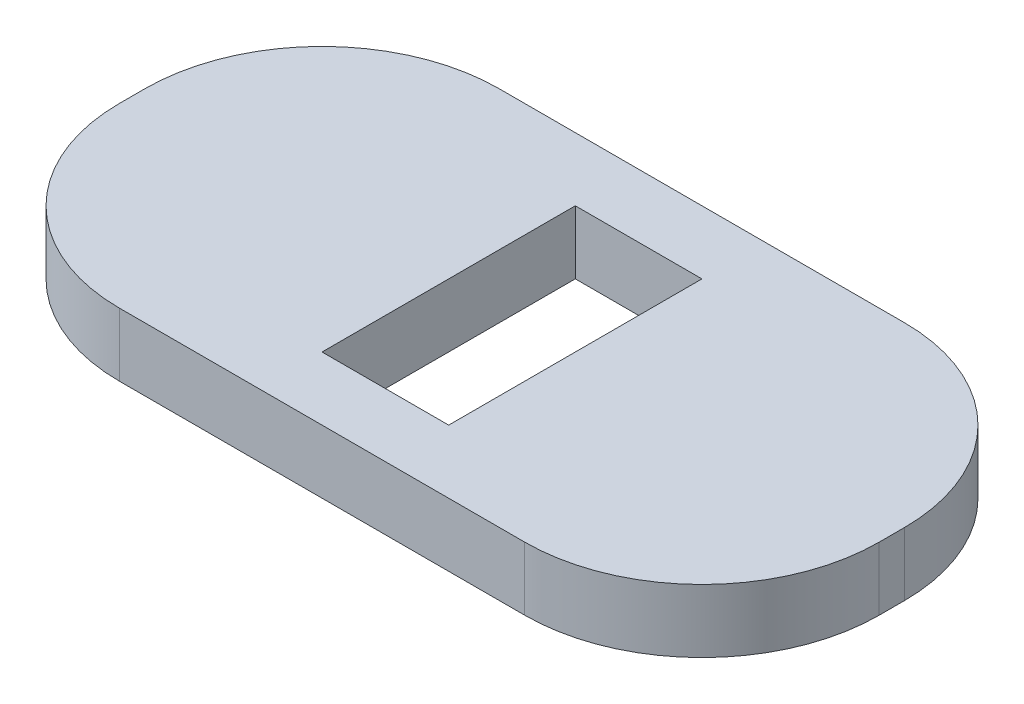
ISO-10303-21;
HEADER;
FILE_DESCRIPTION(('STEP AP214'),'2;1');
FILE_NAME('part.step','',(''),(''),'','','');
FILE_SCHEMA(('AUTOMOTIVE_DESIGN { 1 0 10303 214 1 1 1 1 }'));
ENDSEC;
DATA;
#1=APPLICATION_CONTEXT('core data for automotive mechanical design processes');
#2=APPLICATION_PROTOCOL_DEFINITION('international standard','automotive_design',2000,#1);
#3=PRODUCT_CONTEXT('',#1,'mechanical');
#4=PRODUCT('Part','Part','',(#3));
#5=PRODUCT_RELATED_PRODUCT_CATEGORY('part','',(#4));
#6=PRODUCT_DEFINITION_FORMATION('','',#4);
#7=PRODUCT_DEFINITION_CONTEXT('part definition',#1,'design');
#8=PRODUCT_DEFINITION('design','',#6,#7);
#9=PRODUCT_DEFINITION_SHAPE('','',#8);
#10=(LENGTH_UNIT() NAMED_UNIT(*) SI_UNIT(.MILLI.,.METRE.));
#11=(NAMED_UNIT(*) PLANE_ANGLE_UNIT() SI_UNIT($,.RADIAN.));
#12=(NAMED_UNIT(*) SI_UNIT($,.STERADIAN.) SOLID_ANGLE_UNIT());
#13=UNCERTAINTY_MEASURE_WITH_UNIT(LENGTH_MEASURE(1.E-05),#10,'distance_accuracy_value','');
#14=(GEOMETRIC_REPRESENTATION_CONTEXT(3) GLOBAL_UNCERTAINTY_ASSIGNED_CONTEXT((#13)) GLOBAL_UNIT_ASSIGNED_CONTEXT((#10,
#11,#12)) REPRESENTATION_CONTEXT('',''));
#15=CARTESIAN_POINT('',(0.,0.,0.));
#16=DIRECTION('',(0.,0.,1.));
#17=DIRECTION('',(1.,0.,0.));
#18=AXIS2_PLACEMENT_3D('',#15,#16,#17);
#19=CARTESIAN_POINT('',(58.42,6.35,-17.78));
#20=DIRECTION('',(0.,1.,0.));
#21=DIRECTION('',(0.,0.,1.));
#22=AXIS2_PLACEMENT_3D('',#19,#20,#21);
#23=PLANE('',#22);
#24=CARTESIAN_POINT('',(58.42,6.35,-17.78));
#25=DIRECTION('',(0.,1.,0.));
#26=DIRECTION('',(0.,0.,1.));
#27=AXIS2_PLACEMENT_3D('',#24,#25,#26);
#28=CIRCLE('',#27,17.78);
#29=CARTESIAN_POINT('',(58.4199999999999,6.35,0.));
#30=VERTEX_POINT('',#29);
#31=CARTESIAN_POINT('',(76.2,6.35,-17.7800000000001));
#32=VERTEX_POINT('',#31);
#33=EDGE_CURVE('E158',#30,#32,#28,.T.);
#34=ORIENTED_EDGE('',*,*,#33,.T.);
#35=DIRECTION('',(0.,0.,-1.));
#36=VECTOR('',#35,1.);
#37=CARTESIAN_POINT('',(76.2,6.35,-17.7800000000001));
#38=LINE('',#37,#36);
#39=CARTESIAN_POINT('',(76.2,6.35,-20.3199999999999));
#40=VERTEX_POINT('',#39);
#41=EDGE_CURVE('E161',#32,#40,#38,.T.);
#42=ORIENTED_EDGE('',*,*,#41,.T.);
#43=CARTESIAN_POINT('',(58.42,6.35,-20.32));
#44=DIRECTION('',(0.,1.,0.));
#45=DIRECTION('',(0.,0.,-1.));
#46=AXIS2_PLACEMENT_3D('',#43,#44,#45);
#47=CIRCLE('',#46,17.78);
#48=CARTESIAN_POINT('',(58.4199999999999,6.35,-38.1));
#49=VERTEX_POINT('',#48);
#50=EDGE_CURVE('E164',#40,#49,#47,.T.);
#51=ORIENTED_EDGE('',*,*,#50,.T.);
#52=DIRECTION('',(-1.,0.,0.));
#53=VECTOR('',#52,1.);
#54=CARTESIAN_POINT('',(17.7800000000001,6.35,-38.1));
#55=LINE('',#54,#53);
#56=CARTESIAN_POINT('',(17.7800000000001,6.35,-38.1));
#57=VERTEX_POINT('',#56);
#58=EDGE_CURVE('E166',#49,#57,#55,.T.);
#59=ORIENTED_EDGE('',*,*,#58,.T.);
#60=CARTESIAN_POINT('',(17.78,6.35,-20.32));
#61=DIRECTION('',(0.,1.,0.));
#62=DIRECTION('',(0.,0.,-1.));
#63=AXIS2_PLACEMENT_3D('',#60,#61,#62);
#64=CIRCLE('',#63,17.78);
#65=CARTESIAN_POINT('',(0.,6.35,-20.3199999999999));
#66=VERTEX_POINT('',#65);
#67=EDGE_CURVE('E168',#57,#66,#64,.T.);
#68=ORIENTED_EDGE('',*,*,#67,.T.);
#69=DIRECTION('',(0.,0.,1.));
#70=VECTOR('',#69,1.);
#71=CARTESIAN_POINT('',(0.,6.35,-17.7800000000001));
#72=LINE('',#71,#70);
#73=CARTESIAN_POINT('',(0.,6.35,-17.7800000000001));
#74=VERTEX_POINT('',#73);
#75=EDGE_CURVE('E170',#66,#74,#72,.T.);
#76=ORIENTED_EDGE('',*,*,#75,.T.);
#77=CARTESIAN_POINT('',(17.78,6.35,-17.78));
#78=DIRECTION('',(0.,1.,0.));
#79=DIRECTION('',(0.,0.,-1.));
#80=AXIS2_PLACEMENT_3D('',#77,#78,#79);
#81=CIRCLE('',#80,17.78);
#82=CARTESIAN_POINT('',(17.7800000000001,6.35,0.));
#83=VERTEX_POINT('',#82);
#84=EDGE_CURVE('E172',#74,#83,#81,.T.);
#85=ORIENTED_EDGE('',*,*,#84,.T.);
#86=DIRECTION('',(1.,0.,0.));
#87=VECTOR('',#86,1.);
#88=CARTESIAN_POINT('',(17.7800000000001,6.35,0.));
#89=LINE('',#88,#87);
#90=EDGE_CURVE('E174',#83,#30,#89,.T.);
#91=ORIENTED_EDGE('',*,*,#90,.T.);
#92=EDGE_LOOP('',(#34,#42,#51,#59,#68,#76,#85,#91));
#93=FACE_BOUND('',#92,.T.);
#94=DIRECTION('',(-1.,0.,0.));
#95=VECTOR('',#94,1.);
#96=CARTESIAN_POINT('',(31.75,6.35,-31.75));
#97=LINE('',#96,#95);
#98=CARTESIAN_POINT('',(44.45,6.35,-31.75));
#99=VERTEX_POINT('',#98);
#100=CARTESIAN_POINT('',(31.75,6.35,-31.75));
#101=VERTEX_POINT('',#100);
#102=EDGE_CURVE('E130',#99,#101,#97,.T.);
#103=ORIENTED_EDGE('',*,*,#102,.F.);
#104=DIRECTION('',(0.,0.,-1.));
#105=VECTOR('',#104,1.);
#106=CARTESIAN_POINT('',(44.45,6.35,-6.35));
#107=LINE('',#106,#105);
#108=CARTESIAN_POINT('',(44.45,6.35,-6.35));
#109=VERTEX_POINT('',#108);
#110=EDGE_CURVE('E122',#109,#99,#107,.T.);
#111=ORIENTED_EDGE('',*,*,#110,.F.);
#112=DIRECTION('',(1.,0.,0.));
#113=VECTOR('',#112,1.);
#114=CARTESIAN_POINT('',(31.75,6.35,-6.35));
#115=LINE('',#114,#113);
#116=CARTESIAN_POINT('',(31.75,6.35,-6.35));
#117=VERTEX_POINT('',#116);
#118=EDGE_CURVE('E144',#117,#109,#115,.T.);
#119=ORIENTED_EDGE('',*,*,#118,.F.);
#120=DIRECTION('',(0.,0.,1.));
#121=VECTOR('',#120,1.);
#122=CARTESIAN_POINT('',(31.75,6.35,-6.35));
#123=LINE('',#122,#121);
#124=EDGE_CURVE('E142',#101,#117,#123,.T.);
#125=ORIENTED_EDGE('',*,*,#124,.F.);
#126=EDGE_LOOP('',(#103,#111,#119,#125));
#127=FACE_BOUND('',#126,.T.);
#128=ADVANCED_FACE('F33',(#93,#127),#23,.T.);
#129=CARTESIAN_POINT('',(58.42,0.,-17.78));
#130=DIRECTION('',(0.,1.,0.));
#131=DIRECTION('',(0.,0.,1.));
#132=AXIS2_PLACEMENT_3D('',#129,#130,#131);
#133=PLANE('',#132);
#134=CARTESIAN_POINT('',(58.42,0.,-17.78));
#135=DIRECTION('',(0.,1.,0.));
#136=DIRECTION('',(0.,0.,1.));
#137=AXIS2_PLACEMENT_3D('',#134,#135,#136);
#138=CIRCLE('',#137,17.78);
#139=CARTESIAN_POINT('',(58.4199999999999,0.,0.));
#140=VERTEX_POINT('',#139);
#141=CARTESIAN_POINT('',(76.2,0.,-17.7800000000001));
#142=VERTEX_POINT('',#141);
#143=EDGE_CURVE('E138',#140,#142,#138,.T.);
#144=ORIENTED_EDGE('',*,*,#143,.F.);
#145=DIRECTION('',(1.,0.,0.));
#146=VECTOR('',#145,1.);
#147=CARTESIAN_POINT('',(17.7800000000001,0.,0.));
#148=LINE('',#147,#146);
#149=CARTESIAN_POINT('',(17.7800000000001,0.,0.));
#150=VERTEX_POINT('',#149);
#151=EDGE_CURVE('E162',#150,#140,#148,.T.);
#152=ORIENTED_EDGE('',*,*,#151,.F.);
#153=CARTESIAN_POINT('',(17.78,0.,-17.78));
#154=DIRECTION('',(0.,1.,0.));
#155=DIRECTION('',(0.,0.,-1.));
#156=AXIS2_PLACEMENT_3D('',#153,#154,#155);
#157=CIRCLE('',#156,17.78);
#158=CARTESIAN_POINT('',(0.,0.,-17.7800000000001));
#159=VERTEX_POINT('',#158);
#160=EDGE_CURVE('E189',#159,#150,#157,.T.);
#161=ORIENTED_EDGE('',*,*,#160,.F.);
#162=DIRECTION('',(0.,0.,1.));
#163=VECTOR('',#162,1.);
#164=CARTESIAN_POINT('',(0.,0.,-17.7800000000001));
#165=LINE('',#164,#163);
#166=CARTESIAN_POINT('',(0.,0.,-20.3199999999999));
#167=VERTEX_POINT('',#166);
#168=EDGE_CURVE('E187',#167,#159,#165,.T.);
#169=ORIENTED_EDGE('',*,*,#168,.F.);
#170=CARTESIAN_POINT('',(17.78,0.,-20.32));
#171=DIRECTION('',(0.,1.,0.));
#172=DIRECTION('',(0.,0.,-1.));
#173=AXIS2_PLACEMENT_3D('',#170,#171,#172);
#174=CIRCLE('',#173,17.78);
#175=CARTESIAN_POINT('',(17.7800000000001,0.,-38.1));
#176=VERTEX_POINT('',#175);
#177=EDGE_CURVE('E185',#176,#167,#174,.T.);
#178=ORIENTED_EDGE('',*,*,#177,.F.);
#179=DIRECTION('',(-1.,0.,0.));
#180=VECTOR('',#179,1.);
#181=CARTESIAN_POINT('',(17.7800000000001,0.,-38.1));
#182=LINE('',#181,#180);
#183=CARTESIAN_POINT('',(58.4199999999999,0.,-38.1));
#184=VERTEX_POINT('',#183);
#185=EDGE_CURVE('E183',#184,#176,#182,.T.);
#186=ORIENTED_EDGE('',*,*,#185,.F.);
#187=CARTESIAN_POINT('',(58.42,0.,-20.32));
#188=DIRECTION('',(0.,1.,0.));
#189=DIRECTION('',(0.,0.,-1.));
#190=AXIS2_PLACEMENT_3D('',#187,#188,#189);
#191=CIRCLE('',#190,17.78);
#192=CARTESIAN_POINT('',(76.2,0.,-20.3199999999999));
#193=VERTEX_POINT('',#192);
#194=EDGE_CURVE('E181',#193,#184,#191,.T.);
#195=ORIENTED_EDGE('',*,*,#194,.F.);
#196=DIRECTION('',(0.,0.,-1.));
#197=VECTOR('',#196,1.);
#198=CARTESIAN_POINT('',(76.2,0.,-17.7800000000001));
#199=LINE('',#198,#197);
#200=EDGE_CURVE('E179',#142,#193,#199,.T.);
#201=ORIENTED_EDGE('',*,*,#200,.F.);
#202=EDGE_LOOP('',(#144,#152,#161,#169,#178,#186,#195,#201));
#203=FACE_BOUND('',#202,.T.);
#204=DIRECTION('',(0.,0.,-1.));
#205=VECTOR('',#204,1.);
#206=CARTESIAN_POINT('',(44.45,0.,-6.35));
#207=LINE('',#206,#205);
#208=CARTESIAN_POINT('',(44.45,0.,-6.35));
#209=VERTEX_POINT('',#208);
#210=CARTESIAN_POINT('',(44.45,0.,-31.75));
#211=VERTEX_POINT('',#210);
#212=EDGE_CURVE('E56',#209,#211,#207,.T.);
#213=ORIENTED_EDGE('',*,*,#212,.T.);
#214=DIRECTION('',(-1.,0.,0.));
#215=VECTOR('',#214,1.);
#216=CARTESIAN_POINT('',(31.75,0.,-31.75));
#217=LINE('',#216,#215);
#218=CARTESIAN_POINT('',(31.75,0.,-31.75));
#219=VERTEX_POINT('',#218);
#220=EDGE_CURVE('E137',#211,#219,#217,.T.);
#221=ORIENTED_EDGE('',*,*,#220,.T.);
#222=DIRECTION('',(0.,0.,1.));
#223=VECTOR('',#222,1.);
#224=CARTESIAN_POINT('',(31.75,0.,-6.35));
#225=LINE('',#224,#223);
#226=CARTESIAN_POINT('',(31.75,0.,-6.35));
#227=VERTEX_POINT('',#226);
#228=EDGE_CURVE('E150',#219,#227,#225,.T.);
#229=ORIENTED_EDGE('',*,*,#228,.T.);
#230=DIRECTION('',(1.,0.,0.));
#231=VECTOR('',#230,1.);
#232=CARTESIAN_POINT('',(31.75,0.,-6.35));
#233=LINE('',#232,#231);
#234=EDGE_CURVE('E131',#227,#209,#233,.T.);
#235=ORIENTED_EDGE('',*,*,#234,.T.);
#236=EDGE_LOOP('',(#213,#221,#229,#235));
#237=FACE_BOUND('',#236,.T.);
#238=ADVANCED_FACE('F219',(#203,#237),#133,.F.);
#239=CARTESIAN_POINT('',(58.42,6.35,-17.78));
#240=DIRECTION('',(0.,-1.,0.));
#241=DIRECTION('',(0.,0.,-1.));
#242=AXIS2_PLACEMENT_3D('',#239,#240,#241);
#243=CYLINDRICAL_SURFACE('',#242,17.78);
#244=ORIENTED_EDGE('',*,*,#143,.T.);
#245=DIRECTION('',(0.,-1.,0.));
#246=VECTOR('',#245,1.);
#247=CARTESIAN_POINT('',(76.2,6.35,-17.7800000000001));
#248=LINE('',#247,#246);
#249=EDGE_CURVE('E11',#32,#142,#248,.T.);
#250=ORIENTED_EDGE('',*,*,#249,.F.);
#251=ORIENTED_EDGE('',*,*,#33,.F.);
#252=DIRECTION('',(0.,-1.,0.));
#253=VECTOR('',#252,1.);
#254=CARTESIAN_POINT('',(58.4199999999999,6.35,0.));
#255=LINE('',#254,#253);
#256=EDGE_CURVE('E176',#30,#140,#255,.T.);
#257=ORIENTED_EDGE('',*,*,#256,.T.);
#258=EDGE_LOOP('',(#244,#250,#251,#257));
#259=FACE_BOUND('',#258,.T.);
#260=ADVANCED_FACE('F35',(#259),#243,.T.);
#261=CARTESIAN_POINT('',(76.2,6.35,-17.7800000000001));
#262=DIRECTION('',(-1.,0.,0.));
#263=DIRECTION('',(0.,0.,1.));
#264=AXIS2_PLACEMENT_3D('',#261,#262,#263);
#265=PLANE('',#264);
#266=ORIENTED_EDGE('',*,*,#200,.T.);
#267=DIRECTION('',(0.,-1.,0.));
#268=VECTOR('',#267,1.);
#269=CARTESIAN_POINT('',(76.2,6.35,-20.3199999999999));
#270=LINE('',#269,#268);
#271=EDGE_CURVE('E41',#40,#193,#270,.T.);
#272=ORIENTED_EDGE('',*,*,#271,.F.);
#273=ORIENTED_EDGE('',*,*,#41,.F.);
#274=ORIENTED_EDGE('',*,*,#249,.T.);
#275=EDGE_LOOP('',(#266,#272,#273,#274));
#276=FACE_BOUND('',#275,.T.);
#277=ADVANCED_FACE('F236',(#276),#265,.F.);
#278=CARTESIAN_POINT('',(58.42,6.35,-20.32));
#279=DIRECTION('',(0.,-1.,0.));
#280=DIRECTION('',(0.,0.,-1.));
#281=AXIS2_PLACEMENT_3D('',#278,#279,#280);
#282=CYLINDRICAL_SURFACE('',#281,17.78);
#283=ORIENTED_EDGE('',*,*,#194,.T.);
#284=DIRECTION('',(0.,-1.,0.));
#285=VECTOR('',#284,1.);
#286=CARTESIAN_POINT('',(58.4199999999999,6.35,-38.1));
#287=LINE('',#286,#285);
#288=EDGE_CURVE('E206',#49,#184,#287,.T.);
#289=ORIENTED_EDGE('',*,*,#288,.F.);
#290=ORIENTED_EDGE('',*,*,#50,.F.);
#291=ORIENTED_EDGE('',*,*,#271,.T.);
#292=EDGE_LOOP('',(#283,#289,#290,#291));
#293=FACE_BOUND('',#292,.T.);
#294=ADVANCED_FACE('F213',(#293),#282,.T.);
#295=CARTESIAN_POINT('',(17.7800000000001,6.35,-38.1));
#296=DIRECTION('',(0.,0.,1.));
#297=DIRECTION('',(1.,0.,0.));
#298=AXIS2_PLACEMENT_3D('',#295,#296,#297);
#299=PLANE('',#298);
#300=ORIENTED_EDGE('',*,*,#185,.T.);
#301=DIRECTION('',(0.,-1.,0.));
#302=VECTOR('',#301,1.);
#303=CARTESIAN_POINT('',(17.7800000000001,6.35,-38.1));
#304=LINE('',#303,#302);
#305=EDGE_CURVE('E203',#57,#176,#304,.T.);
#306=ORIENTED_EDGE('',*,*,#305,.F.);
#307=ORIENTED_EDGE('',*,*,#58,.F.);
#308=ORIENTED_EDGE('',*,*,#288,.T.);
#309=EDGE_LOOP('',(#300,#306,#307,#308));
#310=FACE_BOUND('',#309,.T.);
#311=ADVANCED_FACE('F225',(#310),#299,.F.);
#312=CARTESIAN_POINT('',(17.78,6.35,-20.32));
#313=DIRECTION('',(0.,-1.,0.));
#314=DIRECTION('',(0.,0.,-1.));
#315=AXIS2_PLACEMENT_3D('',#312,#313,#314);
#316=CYLINDRICAL_SURFACE('',#315,17.78);
#317=ORIENTED_EDGE('',*,*,#177,.T.);
#318=DIRECTION('',(0.,-1.,0.));
#319=VECTOR('',#318,1.);
#320=CARTESIAN_POINT('',(0.,6.35,-20.3199999999999));
#321=LINE('',#320,#319);
#322=EDGE_CURVE('E200',#66,#167,#321,.T.);
#323=ORIENTED_EDGE('',*,*,#322,.F.);
#324=ORIENTED_EDGE('',*,*,#67,.F.);
#325=ORIENTED_EDGE('',*,*,#305,.T.);
#326=EDGE_LOOP('',(#317,#323,#324,#325));
#327=FACE_BOUND('',#326,.T.);
#328=ADVANCED_FACE('F229',(#327),#316,.T.);
#329=CARTESIAN_POINT('',(0.,6.35,-17.7800000000001));
#330=DIRECTION('',(1.,0.,0.));
#331=DIRECTION('',(0.,0.,-1.));
#332=AXIS2_PLACEMENT_3D('',#329,#330,#331);
#333=PLANE('',#332);
#334=ORIENTED_EDGE('',*,*,#168,.T.);
#335=DIRECTION('',(0.,-1.,0.));
#336=VECTOR('',#335,1.);
#337=CARTESIAN_POINT('',(0.,6.35,-17.7800000000001));
#338=LINE('',#337,#336);
#339=EDGE_CURVE('E197',#74,#159,#338,.T.);
#340=ORIENTED_EDGE('',*,*,#339,.F.);
#341=ORIENTED_EDGE('',*,*,#75,.F.);
#342=ORIENTED_EDGE('',*,*,#322,.T.);
#343=EDGE_LOOP('',(#334,#340,#341,#342));
#344=FACE_BOUND('',#343,.T.);
#345=ADVANCED_FACE('F249',(#344),#333,.F.);
#346=CARTESIAN_POINT('',(17.78,6.35,-17.78));
#347=DIRECTION('',(0.,-1.,0.));
#348=DIRECTION('',(0.,0.,-1.));
#349=AXIS2_PLACEMENT_3D('',#346,#347,#348);
#350=CYLINDRICAL_SURFACE('',#349,17.78);
#351=ORIENTED_EDGE('',*,*,#160,.T.);
#352=DIRECTION('',(0.,-1.,0.));
#353=VECTOR('',#352,1.);
#354=CARTESIAN_POINT('',(17.7800000000001,6.35,0.));
#355=LINE('',#354,#353);
#356=EDGE_CURVE('E194',#83,#150,#355,.T.);
#357=ORIENTED_EDGE('',*,*,#356,.F.);
#358=ORIENTED_EDGE('',*,*,#84,.F.);
#359=ORIENTED_EDGE('',*,*,#339,.T.);
#360=EDGE_LOOP('',(#351,#357,#358,#359));
#361=FACE_BOUND('',#360,.T.);
#362=ADVANCED_FACE('F247',(#361),#350,.T.);
#363=CARTESIAN_POINT('',(17.7800000000001,6.35,0.));
#364=DIRECTION('',(0.,0.,-1.));
#365=DIRECTION('',(-1.,0.,0.));
#366=AXIS2_PLACEMENT_3D('',#363,#364,#365);
#367=PLANE('',#366);
#368=ORIENTED_EDGE('',*,*,#151,.T.);
#369=ORIENTED_EDGE('',*,*,#256,.F.);
#370=ORIENTED_EDGE('',*,*,#90,.F.);
#371=ORIENTED_EDGE('',*,*,#356,.T.);
#372=EDGE_LOOP('',(#368,#369,#370,#371));
#373=FACE_BOUND('',#372,.T.);
#374=ADVANCED_FACE('F242',(#373),#367,.F.);
#375=CARTESIAN_POINT('',(44.45,6.35,-6.35));
#376=DIRECTION('',(-1.,0.,0.));
#377=DIRECTION('',(0.,0.,1.));
#378=AXIS2_PLACEMENT_3D('',#375,#376,#377);
#379=PLANE('',#378);
#380=ORIENTED_EDGE('',*,*,#212,.F.);
#381=DIRECTION('',(0.,-1.,0.));
#382=VECTOR('',#381,1.);
#383=CARTESIAN_POINT('',(44.45,6.35,-6.35));
#384=LINE('',#383,#382);
#385=EDGE_CURVE('E126',#109,#209,#384,.T.);
#386=ORIENTED_EDGE('',*,*,#385,.F.);
#387=ORIENTED_EDGE('',*,*,#110,.T.);
#388=DIRECTION('',(0.,-1.,0.));
#389=VECTOR('',#388,1.);
#390=CARTESIAN_POINT('',(44.45,6.35,-31.75));
#391=LINE('',#390,#389);
#392=EDGE_CURVE('E125',#99,#211,#391,.T.);
#393=ORIENTED_EDGE('',*,*,#392,.T.);
#394=EDGE_LOOP('',(#380,#386,#387,#393));
#395=FACE_BOUND('',#394,.T.);
#396=ADVANCED_FACE('F124',(#395),#379,.T.);
#397=CARTESIAN_POINT('',(31.75,6.35,-31.75));
#398=DIRECTION('',(0.,0.,1.));
#399=DIRECTION('',(1.,0.,0.));
#400=AXIS2_PLACEMENT_3D('',#397,#398,#399);
#401=PLANE('',#400);
#402=ORIENTED_EDGE('',*,*,#220,.F.);
#403=ORIENTED_EDGE('',*,*,#392,.F.);
#404=ORIENTED_EDGE('',*,*,#102,.T.);
#405=DIRECTION('',(0.,-1.,0.));
#406=VECTOR('',#405,1.);
#407=CARTESIAN_POINT('',(31.75,6.35,-31.75));
#408=LINE('',#407,#406);
#409=EDGE_CURVE('E139',#101,#219,#408,.T.);
#410=ORIENTED_EDGE('',*,*,#409,.T.);
#411=EDGE_LOOP('',(#402,#403,#404,#410));
#412=FACE_BOUND('',#411,.T.);
#413=ADVANCED_FACE('F134',(#412),#401,.T.);
#414=CARTESIAN_POINT('',(31.75,6.35,-6.35));
#415=DIRECTION('',(1.,0.,0.));
#416=DIRECTION('',(0.,0.,-1.));
#417=AXIS2_PLACEMENT_3D('',#414,#415,#416);
#418=PLANE('',#417);
#419=ORIENTED_EDGE('',*,*,#228,.F.);
#420=ORIENTED_EDGE('',*,*,#409,.F.);
#421=ORIENTED_EDGE('',*,*,#124,.T.);
#422=DIRECTION('',(0.,-1.,0.));
#423=VECTOR('',#422,1.);
#424=CARTESIAN_POINT('',(31.75,6.35,-6.35));
#425=LINE('',#424,#423);
#426=EDGE_CURVE('E48',#117,#227,#425,.T.);
#427=ORIENTED_EDGE('',*,*,#426,.T.);
#428=EDGE_LOOP('',(#419,#420,#421,#427));
#429=FACE_BOUND('',#428,.T.);
#430=ADVANCED_FACE('F274',(#429),#418,.T.);
#431=CARTESIAN_POINT('',(31.75,6.35,-6.35));
#432=DIRECTION('',(0.,0.,-1.));
#433=DIRECTION('',(-1.,0.,0.));
#434=AXIS2_PLACEMENT_3D('',#431,#432,#433);
#435=PLANE('',#434);
#436=ORIENTED_EDGE('',*,*,#234,.F.);
#437=ORIENTED_EDGE('',*,*,#426,.F.);
#438=ORIENTED_EDGE('',*,*,#118,.T.);
#439=ORIENTED_EDGE('',*,*,#385,.T.);
#440=EDGE_LOOP('',(#436,#437,#438,#439));
#441=FACE_BOUND('',#440,.T.);
#442=ADVANCED_FACE('F278',(#441),#435,.T.);
#443=CLOSED_SHELL('',(#128,#238,#260,#277,#294,#311,#328,#345,#362,#374,#396,#413,#430,#442));
#444=MANIFOLD_SOLID_BREP('B2',#443);
#445=ADVANCED_BREP_SHAPE_REPRESENTATION('',(#18,#444),#14);
#446=SHAPE_DEFINITION_REPRESENTATION(#9,#445);
ENDSEC;
END-ISO-10303-21;
